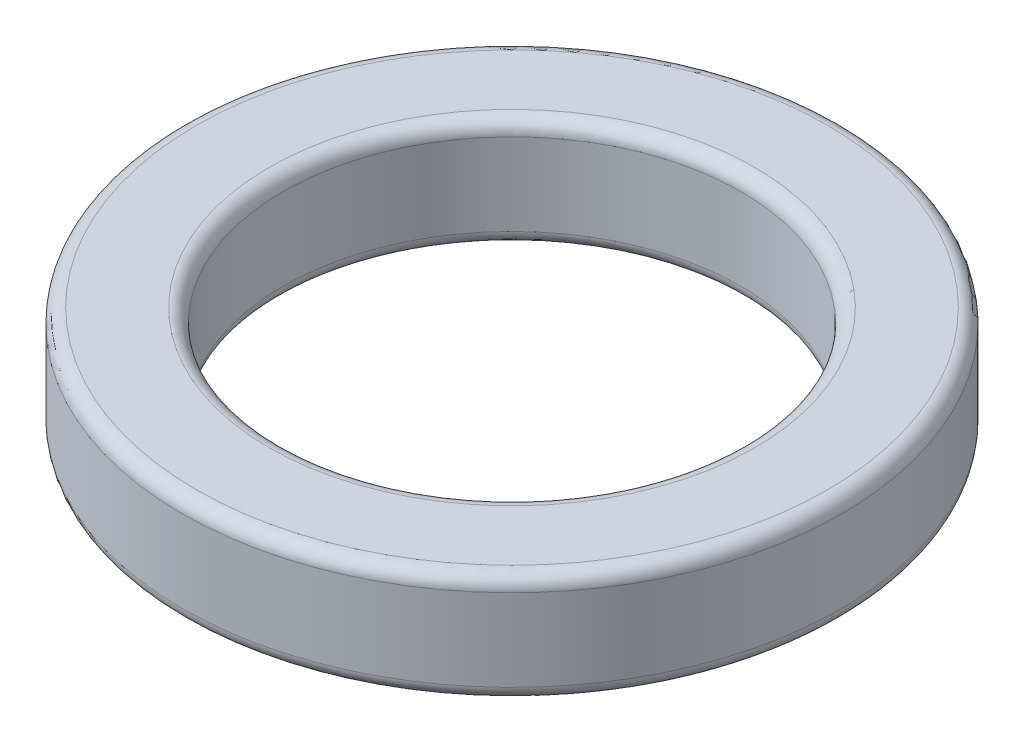
ISO-10303-21;
HEADER;
FILE_DESCRIPTION(('STEP AP214'),'2;1');
FILE_NAME('part.step','',(''),(''),'','','');
FILE_SCHEMA(('AUTOMOTIVE_DESIGN { 1 0 10303 214 1 1 1 1 }'));
ENDSEC;
DATA;
#1=APPLICATION_CONTEXT('core data for automotive mechanical design processes');
#2=APPLICATION_PROTOCOL_DEFINITION('international standard','automotive_design',2000,#1);
#3=PRODUCT_CONTEXT('',#1,'mechanical');
#4=PRODUCT('Part','Part','',(#3));
#5=PRODUCT_RELATED_PRODUCT_CATEGORY('part','',(#4));
#6=PRODUCT_DEFINITION_FORMATION('','',#4);
#7=PRODUCT_DEFINITION_CONTEXT('part definition',#1,'design');
#8=PRODUCT_DEFINITION('design','',#6,#7);
#9=PRODUCT_DEFINITION_SHAPE('','',#8);
#10=(LENGTH_UNIT() NAMED_UNIT(*) SI_UNIT(.MILLI.,.METRE.));
#11=(NAMED_UNIT(*) PLANE_ANGLE_UNIT() SI_UNIT($,.RADIAN.));
#12=(NAMED_UNIT(*) SI_UNIT($,.STERADIAN.) SOLID_ANGLE_UNIT());
#13=UNCERTAINTY_MEASURE_WITH_UNIT(LENGTH_MEASURE(1.E-05),#10,'distance_accuracy_value','');
#14=(GEOMETRIC_REPRESENTATION_CONTEXT(3) GLOBAL_UNCERTAINTY_ASSIGNED_CONTEXT((#13)) GLOBAL_UNIT_ASSIGNED_CONTEXT((#10,
#11,#12)) REPRESENTATION_CONTEXT('',''));
#15=CARTESIAN_POINT('',(0.,0.,0.));
#16=DIRECTION('',(0.,0.,1.));
#17=DIRECTION('',(1.,0.,0.));
#18=AXIS2_PLACEMENT_3D('',#15,#16,#17);
#19=CARTESIAN_POINT('',(0.,6.,0.));
#20=DIRECTION('',(0.,1.,0.));
#21=DIRECTION('',(0.,0.,1.));
#22=AXIS2_PLACEMENT_3D('',#19,#20,#21);
#23=PLANE('',#22);
#24=CARTESIAN_POINT('',(0.,6.,0.));
#25=DIRECTION('',(0.,1.,0.));
#26=DIRECTION('',(0.,0.,1.));
#27=AXIS2_PLACEMENT_3D('',#24,#25,#26);
#28=CIRCLE('',#27,26.524);
#29=CARTESIAN_POINT('',(0.,6.,26.524));
#30=VERTEX_POINT('',#29);
#31=EDGE_CURVE('E10',#30,#30,#28,.F.);
#32=ORIENTED_EDGE('',*,*,#31,.T.);
#33=EDGE_LOOP('',(#32));
#34=FACE_BOUND('',#33,.T.);
#35=CARTESIAN_POINT('',(0.,6.,0.));
#36=DIRECTION('',(0.,1.,0.));
#37=DIRECTION('',(0.,0.,1.));
#38=AXIS2_PLACEMENT_3D('',#35,#36,#37);
#39=CIRCLE('',#38,34.476);
#40=CARTESIAN_POINT('',(0.,6.,34.476));
#41=VERTEX_POINT('',#40);
#42=EDGE_CURVE('E39',#41,#41,#39,.T.);
#43=ORIENTED_EDGE('',*,*,#42,.T.);
#44=EDGE_LOOP('',(#43));
#45=FACE_BOUND('',#44,.T.);
#46=ADVANCED_FACE('F32',(#34,#45),#23,.T.);
#47=CARTESIAN_POINT('',(0.,-6.,0.));
#48=DIRECTION('',(0.,1.,0.));
#49=DIRECTION('',(0.,0.,1.));
#50=AXIS2_PLACEMENT_3D('',#47,#48,#49);
#51=PLANE('',#50);
#52=CARTESIAN_POINT('',(0.,-6.,0.));
#53=DIRECTION('',(0.,1.,0.));
#54=DIRECTION('',(0.,0.,1.));
#55=AXIS2_PLACEMENT_3D('',#52,#53,#54);
#56=CIRCLE('',#55,34.476);
#57=CARTESIAN_POINT('',(0.,-6.,34.476));
#58=VERTEX_POINT('',#57);
#59=EDGE_CURVE('E52',#58,#58,#56,.F.);
#60=ORIENTED_EDGE('',*,*,#59,.T.);
#61=EDGE_LOOP('',(#60));
#62=FACE_BOUND('',#61,.T.);
#63=CARTESIAN_POINT('',(0.,-6.,0.));
#64=DIRECTION('',(0.,1.,0.));
#65=DIRECTION('',(0.,0.,1.));
#66=AXIS2_PLACEMENT_3D('',#63,#64,#65);
#67=CIRCLE('',#66,26.524);
#68=CARTESIAN_POINT('',(0.,-6.,26.524));
#69=VERTEX_POINT('',#68);
#70=EDGE_CURVE('E55',#69,#69,#67,.T.);
#71=ORIENTED_EDGE('',*,*,#70,.T.);
#72=EDGE_LOOP('',(#71));
#73=FACE_BOUND('',#72,.T.);
#74=ADVANCED_FACE('F76',(#62,#73),#51,.F.);
#75=CARTESIAN_POINT('',(0.,6.,0.));
#76=DIRECTION('',(0.,-1.,0.));
#77=DIRECTION('',(0.,0.,-1.));
#78=AXIS2_PLACEMENT_3D('',#75,#76,#77);
#79=CYLINDRICAL_SURFACE('',#78,36.);
#80=CARTESIAN_POINT('',(0.,-4.476,0.));
#81=DIRECTION('',(0.,1.,0.));
#82=DIRECTION('',(0.,0.,1.));
#83=AXIS2_PLACEMENT_3D('',#80,#81,#82);
#84=CIRCLE('',#83,36.);
#85=CARTESIAN_POINT('',(0.,-4.476,36.));
#86=VERTEX_POINT('',#85);
#87=EDGE_CURVE('E58',#86,#86,#84,.T.);
#88=ORIENTED_EDGE('',*,*,#87,.T.);
#89=EDGE_LOOP('',(#88));
#90=FACE_BOUND('',#89,.T.);
#91=CARTESIAN_POINT('',(0.,4.476,0.));
#92=DIRECTION('',(0.,1.,0.));
#93=DIRECTION('',(0.,0.,1.));
#94=AXIS2_PLACEMENT_3D('',#91,#92,#93);
#95=CIRCLE('',#94,36.);
#96=CARTESIAN_POINT('',(0.,4.476,36.));
#97=VERTEX_POINT('',#96);
#98=EDGE_CURVE('E61',#97,#97,#95,.F.);
#99=ORIENTED_EDGE('',*,*,#98,.T.);
#100=EDGE_LOOP('',(#99));
#101=FACE_BOUND('',#100,.T.);
#102=ADVANCED_FACE('F65',(#90,#101),#79,.T.);
#103=CARTESIAN_POINT('',(0.,6.,0.));
#104=DIRECTION('',(0.,-1.,0.));
#105=DIRECTION('',(0.,0.,-1.));
#106=AXIS2_PLACEMENT_3D('',#103,#104,#105);
#107=CYLINDRICAL_SURFACE('',#106,25.);
#108=CARTESIAN_POINT('',(0.,-4.476,0.));
#109=DIRECTION('',(0.,1.,0.));
#110=DIRECTION('',(0.,0.,1.));
#111=AXIS2_PLACEMENT_3D('',#108,#109,#110);
#112=CIRCLE('',#111,25.);
#113=CARTESIAN_POINT('',(0.,-4.476,25.));
#114=VERTEX_POINT('',#113);
#115=EDGE_CURVE('E43',#114,#114,#112,.F.);
#116=ORIENTED_EDGE('',*,*,#115,.T.);
#117=EDGE_LOOP('',(#116));
#118=FACE_BOUND('',#117,.T.);
#119=CARTESIAN_POINT('',(0.,4.476,0.));
#120=DIRECTION('',(0.,1.,0.));
#121=DIRECTION('',(0.,0.,1.));
#122=AXIS2_PLACEMENT_3D('',#119,#120,#121);
#123=CIRCLE('',#122,25.);
#124=CARTESIAN_POINT('',(0.,4.476,25.));
#125=VERTEX_POINT('',#124);
#126=EDGE_CURVE('E47',#125,#125,#123,.T.);
#127=ORIENTED_EDGE('',*,*,#126,.T.);
#128=EDGE_LOOP('',(#127));
#129=FACE_BOUND('',#128,.T.);
#130=ADVANCED_FACE('F84',(#118,#129),#107,.F.);
#131=CARTESIAN_POINT('',(0.,-4.476,0.));
#132=DIRECTION('',(0.,1.,0.));
#133=DIRECTION('',(0.,0.,1.));
#134=AXIS2_PLACEMENT_3D('',#131,#132,#133);
#135=TOROIDAL_SURFACE('',#134,34.476,1.524);
#136=ORIENTED_EDGE('',*,*,#59,.F.);
#137=EDGE_LOOP('',(#136));
#138=FACE_BOUND('',#137,.T.);
#139=ORIENTED_EDGE('',*,*,#87,.F.);
#140=EDGE_LOOP('',(#139));
#141=FACE_BOUND('',#140,.T.);
#142=ADVANCED_FACE('F89',(#138,#141),#135,.T.);
#143=CARTESIAN_POINT('',(0.,-4.476,0.));
#144=DIRECTION('',(0.,1.,0.));
#145=DIRECTION('',(0.,0.,1.));
#146=AXIS2_PLACEMENT_3D('',#143,#144,#145);
#147=TOROIDAL_SURFACE('',#146,26.524,1.524);
#148=ORIENTED_EDGE('',*,*,#115,.F.);
#149=EDGE_LOOP('',(#148));
#150=FACE_BOUND('',#149,.T.);
#151=ORIENTED_EDGE('',*,*,#70,.F.);
#152=EDGE_LOOP('',(#151));
#153=FACE_BOUND('',#152,.T.);
#154=ADVANCED_FACE('F73',(#150,#153),#147,.T.);
#155=CARTESIAN_POINT('',(0.,4.476,0.));
#156=DIRECTION('',(0.,1.,0.));
#157=DIRECTION('',(0.,0.,1.));
#158=AXIS2_PLACEMENT_3D('',#155,#156,#157);
#159=TOROIDAL_SURFACE('',#158,26.524,1.524);
#160=ORIENTED_EDGE('',*,*,#31,.F.);
#161=EDGE_LOOP('',(#160));
#162=FACE_BOUND('',#161,.T.);
#163=ORIENTED_EDGE('',*,*,#126,.F.);
#164=EDGE_LOOP('',(#163));
#165=FACE_BOUND('',#164,.T.);
#166=ADVANCED_FACE('F69',(#162,#165),#159,.T.);
#167=CARTESIAN_POINT('',(0.,4.476,0.));
#168=DIRECTION('',(0.,1.,0.));
#169=DIRECTION('',(0.,0.,1.));
#170=AXIS2_PLACEMENT_3D('',#167,#168,#169);
#171=TOROIDAL_SURFACE('',#170,34.476,1.524);
#172=ORIENTED_EDGE('',*,*,#98,.F.);
#173=EDGE_LOOP('',(#172));
#174=FACE_BOUND('',#173,.T.);
#175=ORIENTED_EDGE('',*,*,#42,.F.);
#176=EDGE_LOOP('',(#175));
#177=FACE_BOUND('',#176,.T.);
#178=ADVANCED_FACE('F34',(#174,#177),#171,.T.);
#179=CLOSED_SHELL('',(#46,#74,#102,#130,#142,#154,#166,#178));
#180=MANIFOLD_SOLID_BREP('B2',#179);
#181=ADVANCED_BREP_SHAPE_REPRESENTATION('',(#18,#180),#14);
#182=SHAPE_DEFINITION_REPRESENTATION(#9,#181);
ENDSEC;
END-ISO-10303-21;
